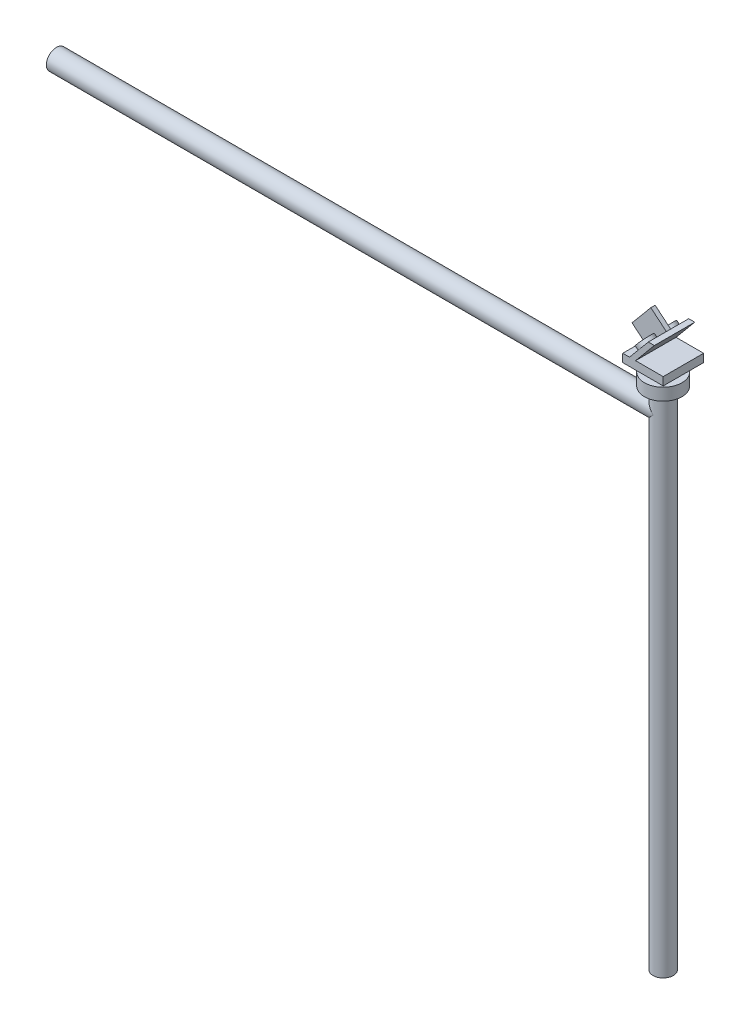
ISO-10303-21;
HEADER;
FILE_DESCRIPTION(('STEP AP214'),'2;1');
FILE_NAME('part.step','',(''),(''),'','','');
FILE_SCHEMA(('AUTOMOTIVE_DESIGN { 1 0 10303 214 1 1 1 1 }'));
ENDSEC;
DATA;
#1=APPLICATION_CONTEXT('core data for automotive mechanical design processes');
#2=APPLICATION_PROTOCOL_DEFINITION('international standard','automotive_design',2000,#1);
#3=PRODUCT_CONTEXT('',#1,'mechanical');
#4=PRODUCT('Part','Part','',(#3));
#5=PRODUCT_RELATED_PRODUCT_CATEGORY('part','',(#4));
#6=PRODUCT_DEFINITION_FORMATION('','',#4);
#7=PRODUCT_DEFINITION_CONTEXT('part definition',#1,'design');
#8=PRODUCT_DEFINITION('design','',#6,#7);
#9=PRODUCT_DEFINITION_SHAPE('','',#8);
#10=(LENGTH_UNIT() NAMED_UNIT(*) SI_UNIT(.MILLI.,.METRE.));
#11=(NAMED_UNIT(*) PLANE_ANGLE_UNIT() SI_UNIT($,.RADIAN.));
#12=(NAMED_UNIT(*) SI_UNIT($,.STERADIAN.) SOLID_ANGLE_UNIT());
#13=UNCERTAINTY_MEASURE_WITH_UNIT(LENGTH_MEASURE(1.E-05),#10,'distance_accuracy_value','');
#14=(GEOMETRIC_REPRESENTATION_CONTEXT(3) GLOBAL_UNCERTAINTY_ASSIGNED_CONTEXT((#13)) GLOBAL_UNIT_ASSIGNED_CONTEXT((#10,
#11,#12)) REPRESENTATION_CONTEXT('',''));
#15=CARTESIAN_POINT('',(0.,0.,0.));
#16=DIRECTION('',(0.,0.,1.));
#17=DIRECTION('',(1.,0.,0.));
#18=AXIS2_PLACEMENT_3D('',#15,#16,#17);
#19=CARTESIAN_POINT('',(-1.77307486485236,135.423873636658,2.7674601771231));
#20=DIRECTION('',(0.767916250220789,-0.640550257705703,0.));
#21=DIRECTION('',(0.640550257705703,0.767916250220789,0.));
#22=AXIS2_PLACEMENT_3D('',#19,#20,#21);
#23=CYLINDRICAL_SURFACE('',#22,2.00000000000001);
#24=CARTESIAN_POINT('',(-1.77307486485236,135.423873636658,2.7674601771231));
#25=DIRECTION('',(-0.767916250220789,0.640550257705703,0.));
#26=DIRECTION('',(-0.640550257705703,-0.767916250220789,0.));
#27=AXIS2_PLACEMENT_3D('',#24,#25,#26);
#28=CIRCLE('',#27,2.00000000000001);
#29=CARTESIAN_POINT('',(-3.05417538026377,133.888041136216,2.7674601771231));
#30=VERTEX_POINT('',#29);
#31=EDGE_CURVE('E11',#30,#30,#28,.T.);
#32=ORIENTED_EDGE('',*,*,#31,.F.);
#33=EDGE_LOOP('',(#32));
#34=FACE_BOUND('',#33,.T.);
#35=CARTESIAN_POINT('',(-1.00515861463157,134.783323378952,2.7674601771231));
#36=DIRECTION('',(-0.767916250220789,0.640550257705703,0.));
#37=DIRECTION('',(-0.640550257705703,-0.767916250220789,0.));
#38=AXIS2_PLACEMENT_3D('',#35,#36,#37);
#39=CIRCLE('',#38,2.00000000000001);
#40=CARTESIAN_POINT('',(-2.28625913004298,133.24749087851,2.7674601771231));
#41=VERTEX_POINT('',#40);
#42=EDGE_CURVE('E53',#41,#41,#39,.T.);
#43=ORIENTED_EDGE('',*,*,#42,.T.);
#44=EDGE_LOOP('',(#43));
#45=FACE_BOUND('',#44,.T.);
#46=ADVANCED_FACE('F50',(#34,#45),#23,.T.);
#47=CARTESIAN_POINT('',(-1.77307486485236,135.423873636658,2.7674601771231));
#48=DIRECTION('',(-0.767916250220789,0.640550257705703,0.));
#49=DIRECTION('',(-0.640550257705703,-0.767916250220789,0.));
#50=AXIS2_PLACEMENT_3D('',#47,#48,#49);
#51=PLANE('',#50);
#52=ORIENTED_EDGE('',*,*,#31,.T.);
#53=EDGE_LOOP('',(#52));
#54=FACE_BOUND('',#53,.T.);
#55=ADVANCED_FACE('F65',(#54),#51,.T.);
#56=CARTESIAN_POINT('',(-1.00515861463157,134.783323378952,2.7674601771231));
#57=DIRECTION('',(-0.767916250220789,0.640550257705703,0.));
#58=DIRECTION('',(-0.640550257705703,-0.767916250220789,0.));
#59=AXIS2_PLACEMENT_3D('',#56,#57,#58);
#60=PLANE('',#59);
#61=ORIENTED_EDGE('',*,*,#42,.F.);
#62=EDGE_LOOP('',(#61));
#63=FACE_BOUND('',#62,.T.);
#64=ADVANCED_FACE('F63',(#63),#60,.F.);
#65=CLOSED_SHELL('',(#46,#55,#64));
#66=MANIFOLD_SOLID_BREP('B2',#65);
#67=CARTESIAN_POINT('',(-1.77307486485236,135.423873636658,-2.76746017712311));
#68=DIRECTION('',(0.767916250220789,-0.640550257705703,0.));
#69=DIRECTION('',(0.640550257705703,0.767916250220789,0.));
#70=AXIS2_PLACEMENT_3D('',#67,#68,#69);
#71=CYLINDRICAL_SURFACE('',#70,2.);
#72=CARTESIAN_POINT('',(-1.77307486485236,135.423873636658,-2.76746017712311));
#73=DIRECTION('',(-0.767916250220789,0.640550257705703,0.));
#74=DIRECTION('',(-0.640550257705703,-0.767916250220789,0.));
#75=AXIS2_PLACEMENT_3D('',#72,#73,#74);
#76=CIRCLE('',#75,2.);
#77=CARTESIAN_POINT('',(-3.05417538026377,133.888041136216,-2.76746017712311));
#78=VERTEX_POINT('',#77);
#79=EDGE_CURVE('E49',#78,#78,#76,.T.);
#80=ORIENTED_EDGE('',*,*,#79,.F.);
#81=EDGE_LOOP('',(#80));
#82=FACE_BOUND('',#81,.T.);
#83=CARTESIAN_POINT('',(-1.00515861463157,134.783323378952,-2.76746017712311));
#84=DIRECTION('',(-0.767916250220789,0.640550257705703,0.));
#85=DIRECTION('',(-0.640550257705703,-0.767916250220789,0.));
#86=AXIS2_PLACEMENT_3D('',#83,#84,#85);
#87=CIRCLE('',#86,2.);
#88=CARTESIAN_POINT('',(-2.28625913004298,133.24749087851,-2.76746017712311));
#89=VERTEX_POINT('',#88);
#90=EDGE_CURVE('E104',#89,#89,#87,.T.);
#91=ORIENTED_EDGE('',*,*,#90,.T.);
#92=EDGE_LOOP('',(#91));
#93=FACE_BOUND('',#92,.T.);
#94=ADVANCED_FACE('F101',(#82,#93),#71,.T.);
#95=CARTESIAN_POINT('',(-1.77307486485236,135.423873636658,-2.76746017712311));
#96=DIRECTION('',(-0.767916250220789,0.640550257705703,0.));
#97=DIRECTION('',(-0.640550257705703,-0.767916250220789,0.));
#98=AXIS2_PLACEMENT_3D('',#95,#96,#97);
#99=PLANE('',#98);
#100=ORIENTED_EDGE('',*,*,#79,.T.);
#101=EDGE_LOOP('',(#100));
#102=FACE_BOUND('',#101,.T.);
#103=ADVANCED_FACE('F116',(#102),#99,.T.);
#104=CARTESIAN_POINT('',(-1.00515861463157,134.783323378952,-2.76746017712311));
#105=DIRECTION('',(-0.767916250220789,0.640550257705703,0.));
#106=DIRECTION('',(-0.640550257705703,-0.767916250220789,0.));
#107=AXIS2_PLACEMENT_3D('',#104,#105,#106);
#108=PLANE('',#107);
#109=ORIENTED_EDGE('',*,*,#90,.F.);
#110=EDGE_LOOP('',(#109));
#111=FACE_BOUND('',#110,.T.);
#112=ADVANCED_FACE('F114',(#111),#108,.F.);
#113=CLOSED_SHELL('',(#94,#103,#112));
#114=MANIFOLD_SOLID_BREP('B6',#113);
#115=CARTESIAN_POINT('',(0.,125.,0.));
#116=DIRECTION('',(0.,1.,0.));
#117=DIRECTION('',(0.,0.,1.));
#118=AXIS2_PLACEMENT_3D('',#115,#116,#117);
#119=CYLINDRICAL_SURFACE('',#118,4.63253292566429);
#120=CARTESIAN_POINT('',(0.,125.,0.));
#121=DIRECTION('',(0.,1.,0.));
#122=DIRECTION('',(0.,0.,1.));
#123=AXIS2_PLACEMENT_3D('',#120,#121,#122);
#124=CIRCLE('',#123,4.63253292566429);
#125=CARTESIAN_POINT('',(0.,125.,4.63253292566429));
#126=VERTEX_POINT('',#125);
#127=EDGE_CURVE('E100',#126,#126,#124,.T.);
#128=ORIENTED_EDGE('',*,*,#127,.T.);
#129=EDGE_LOOP('',(#128));
#130=FACE_BOUND('',#129,.T.);
#131=CARTESIAN_POINT('',(0.,128.,0.));
#132=DIRECTION('',(0.,1.,0.));
#133=DIRECTION('',(0.,0.,1.));
#134=AXIS2_PLACEMENT_3D('',#131,#132,#133);
#135=CIRCLE('',#134,4.63253292566429);
#136=CARTESIAN_POINT('',(0.,128.,4.63253292566429));
#137=VERTEX_POINT('',#136);
#138=EDGE_CURVE('E156',#137,#137,#135,.T.);
#139=ORIENTED_EDGE('',*,*,#138,.F.);
#140=EDGE_LOOP('',(#139));
#141=FACE_BOUND('',#140,.T.);
#142=ADVANCED_FACE('F153',(#130,#141),#119,.T.);
#143=CARTESIAN_POINT('',(0.,125.,0.));
#144=DIRECTION('',(0.,1.,0.));
#145=DIRECTION('',(0.,0.,1.));
#146=AXIS2_PLACEMENT_3D('',#143,#144,#145);
#147=PLANE('',#146);
#148=CARTESIAN_POINT('',(0.,125.,0.));
#149=DIRECTION('',(0.,1.,0.));
#150=DIRECTION('',(0.,0.,1.));
#151=AXIS2_PLACEMENT_3D('',#148,#149,#150);
#152=CIRCLE('',#151,2.5);
#153=CARTESIAN_POINT('',(0.,125.,2.5));
#154=VERTEX_POINT('',#153);
#155=EDGE_CURVE('E163',#154,#154,#152,.T.);
#156=ORIENTED_EDGE('',*,*,#155,.T.);
#157=EDGE_LOOP('',(#156));
#158=FACE_BOUND('',#157,.T.);
#159=ORIENTED_EDGE('',*,*,#127,.F.);
#160=EDGE_LOOP('',(#159));
#161=FACE_BOUND('',#160,.T.);
#162=ADVANCED_FACE('F171',(#158,#161),#147,.F.);
#163=CARTESIAN_POINT('',(0.,128.,0.));
#164=DIRECTION('',(0.,1.,0.));
#165=DIRECTION('',(0.,0.,1.));
#166=AXIS2_PLACEMENT_3D('',#163,#164,#165);
#167=PLANE('',#166);
#168=CARTESIAN_POINT('',(0.,128.,0.));
#169=DIRECTION('',(0.,1.,0.));
#170=DIRECTION('',(0.,0.,1.));
#171=AXIS2_PLACEMENT_3D('',#168,#169,#170);
#172=CIRCLE('',#171,2.5);
#173=CARTESIAN_POINT('',(0.,128.,2.5));
#174=VERTEX_POINT('',#173);
#175=EDGE_CURVE('E165',#174,#174,#172,.T.);
#176=ORIENTED_EDGE('',*,*,#175,.F.);
#177=EDGE_LOOP('',(#176));
#178=FACE_BOUND('',#177,.T.);
#179=ORIENTED_EDGE('',*,*,#138,.T.);
#180=EDGE_LOOP('',(#179));
#181=FACE_BOUND('',#180,.T.);
#182=ADVANCED_FACE('F177',(#178,#181),#167,.T.);
#183=CARTESIAN_POINT('',(0.,125.,0.));
#184=DIRECTION('',(0.,1.,0.));
#185=DIRECTION('',(0.,0.,1.));
#186=AXIS2_PLACEMENT_3D('',#183,#184,#185);
#187=CYLINDRICAL_SURFACE('',#186,2.5);
#188=ORIENTED_EDGE('',*,*,#155,.F.);
#189=EDGE_LOOP('',(#188));
#190=FACE_BOUND('',#189,.T.);
#191=ORIENTED_EDGE('',*,*,#175,.T.);
#192=EDGE_LOOP('',(#191));
#193=FACE_BOUND('',#192,.T.);
#194=ADVANCED_FACE('F174',(#190,#193),#187,.F.);
#195=CLOSED_SHELL('',(#142,#162,#182,#194));
#196=MANIFOLD_SOLID_BREP('B44',#195);
#197=CARTESIAN_POINT('',(-3.32684214086689,132.,-5.));
#198=DIRECTION('',(-0.767916250220789,0.640550257705703,0.));
#199=DIRECTION('',(-0.640550257705703,-0.76791625022079,0.));
#200=AXIS2_PLACEMENT_3D('',#197,#198,#199);
#201=PLANE('',#200);
#202=DIRECTION('',(0.,0.,1.));
#203=VECTOR('',#202,1.);
#204=CARTESIAN_POINT('',(1.31652491160376,137.566646757904,-5.));
#205=LINE('',#204,#203);
#206=CARTESIAN_POINT('',(1.31652491160376,137.566646757904,0.53492035424621));
#207=VERTEX_POINT('',#206);
#208=CARTESIAN_POINT('',(1.31652491160376,137.566646757904,5.));
#209=VERTEX_POINT('',#208);
#210=EDGE_CURVE('E375',#207,#209,#205,.T.);
#211=ORIENTED_EDGE('',*,*,#210,.F.);
#212=DIRECTION('',(0.640550257705703,0.767916250220789,0.));
#213=VECTOR('',#212,1.);
#214=CARTESIAN_POINT('',(1.31652491160375,137.566646757904,0.53492035424621));
#215=LINE('',#214,#213);
#216=CARTESIAN_POINT('',(-3.32684214086688,132.,0.53492035424621));
#217=VERTEX_POINT('',#216);
#218=EDGE_CURVE('E233',#217,#207,#215,.T.);
#219=ORIENTED_EDGE('',*,*,#218,.F.);
#220=DIRECTION('',(0.,0.,1.));
#221=VECTOR('',#220,1.);
#222=CARTESIAN_POINT('',(-3.32684214086689,132.,-5.));
#223=LINE('',#222,#221);
#224=CARTESIAN_POINT('',(-3.32684214086689,132.,5.));
#225=VERTEX_POINT('',#224);
#226=EDGE_CURVE('E370',#217,#225,#223,.T.);
#227=ORIENTED_EDGE('',*,*,#226,.T.);
#228=DIRECTION('',(-0.640550257705703,-0.767916250220789,0.));
#229=VECTOR('',#228,1.);
#230=CARTESIAN_POINT('',(-3.32684214086689,132.,5.));
#231=LINE('',#230,#229);
#232=EDGE_CURVE('E351',#209,#225,#231,.T.);
#233=ORIENTED_EDGE('',*,*,#232,.F.);
#234=EDGE_LOOP('',(#211,#219,#227,#233));
#235=FACE_BOUND('',#234,.T.);
#236=ADVANCED_FACE('F217',(#235),#201,.T.);
#237=CARTESIAN_POINT('',(-3.32684214086689,132.,-5.));
#238=VERTEX_POINT('',#237);
#239=CARTESIAN_POINT('',(-3.32684214086688,132.,-0.534920354246212));
#240=VERTEX_POINT('',#239);
#241=EDGE_CURVE('E365',#238,#240,#223,.T.);
#242=ORIENTED_EDGE('',*,*,#241,.T.);
#243=DIRECTION('',(-0.640550257705703,-0.767916250220789,0.));
#244=VECTOR('',#243,1.);
#245=CARTESIAN_POINT('',(1.31652491160375,137.566646757904,-0.534920354246212));
#246=LINE('',#245,#244);
#247=CARTESIAN_POINT('',(1.31652491160375,137.566646757904,-0.534920354246212));
#248=VERTEX_POINT('',#247);
#249=EDGE_CURVE('E536',#248,#240,#246,.T.);
#250=ORIENTED_EDGE('',*,*,#249,.F.);
#251=CARTESIAN_POINT('',(1.31652491160376,137.566646757904,-5.));
#252=VERTEX_POINT('',#251);
#253=EDGE_CURVE('E371',#252,#248,#205,.T.);
#254=ORIENTED_EDGE('',*,*,#253,.F.);
#255=DIRECTION('',(-0.640550257705703,-0.767916250220789,0.));
#256=VECTOR('',#255,1.);
#257=CARTESIAN_POINT('',(-3.32684214086689,132.,-5.));
#258=LINE('',#257,#256);
#259=EDGE_CURVE('E355',#252,#238,#258,.T.);
#260=ORIENTED_EDGE('',*,*,#259,.T.);
#261=EDGE_LOOP('',(#242,#250,#254,#260));
#262=FACE_BOUND('',#261,.T.);
#263=ADVANCED_FACE('F458',(#262),#201,.T.);
#264=CARTESIAN_POINT('',(0.,132.,0.));
#265=DIRECTION('',(0.,1.,0.));
#266=DIRECTION('',(0.,0.,1.));
#267=AXIS2_PLACEMENT_3D('',#264,#265,#266);
#268=PLANE('',#267);
#269=DIRECTION('',(-1.,0.,0.));
#270=VECTOR('',#269,1.);
#271=CARTESIAN_POINT('',(-5.,132.,-5.));
#272=LINE('',#271,#270);
#273=CARTESIAN_POINT('',(5.,132.,-5.));
#274=VERTEX_POINT('',#273);
#275=CARTESIAN_POINT('',(-1.82684214086689,132.,-5.));
#276=VERTEX_POINT('',#275);
#277=EDGE_CURVE('E387',#274,#276,#272,.T.);
#278=ORIENTED_EDGE('',*,*,#277,.T.);
#279=DIRECTION('',(0.,0.,1.));
#280=VECTOR('',#279,1.);
#281=CARTESIAN_POINT('',(-1.82684214086689,132.,-5.));
#282=LINE('',#281,#280);
#283=CARTESIAN_POINT('',(-1.82684214086689,132.,5.));
#284=VERTEX_POINT('',#283);
#285=EDGE_CURVE('E357',#276,#284,#282,.T.);
#286=ORIENTED_EDGE('',*,*,#285,.T.);
#287=DIRECTION('',(1.,0.,0.));
#288=VECTOR('',#287,1.);
#289=CARTESIAN_POINT('',(-5.,132.,5.));
#290=LINE('',#289,#288);
#291=CARTESIAN_POINT('',(5.,132.,5.));
#292=VERTEX_POINT('',#291);
#293=EDGE_CURVE('E394',#284,#292,#290,.T.);
#294=ORIENTED_EDGE('',*,*,#293,.T.);
#295=DIRECTION('',(0.,0.,-1.));
#296=VECTOR('',#295,1.);
#297=CARTESIAN_POINT('',(5.,132.,-5.));
#298=LINE('',#297,#296);
#299=EDGE_CURVE('E381',#292,#274,#298,.T.);
#300=ORIENTED_EDGE('',*,*,#299,.T.);
#301=EDGE_LOOP('',(#278,#286,#294,#300));
#302=FACE_BOUND('',#301,.T.);
#303=ADVANCED_FACE('F455',(#302),#268,.T.);
#304=CARTESIAN_POINT('',(-150.,120.,0.));
#305=DIRECTION('',(-1.,0.,0.));
#306=DIRECTION('',(0.,0.,1.));
#307=AXIS2_PLACEMENT_3D('',#304,#305,#306);
#308=PLANE('',#307);
#309=CARTESIAN_POINT('',(-150.,120.,0.));
#310=DIRECTION('',(-1.,0.,0.));
#311=DIRECTION('',(0.,0.,1.));
#312=AXIS2_PLACEMENT_3D('',#309,#310,#311);
#313=CIRCLE('',#312,2.5);
#314=CARTESIAN_POINT('',(-150.,120.,2.5));
#315=VERTEX_POINT('',#314);
#316=EDGE_CURVE('E430',#315,#315,#313,.T.);
#317=ORIENTED_EDGE('',*,*,#316,.T.);
#318=EDGE_LOOP('',(#317));
#319=FACE_BOUND('',#318,.T.);
#320=ADVANCED_FACE('F219',(#319),#308,.T.);
#321=CARTESIAN_POINT('',(0.,0.,0.));
#322=DIRECTION('',(0.,1.,0.));
#323=DIRECTION('',(0.,0.,1.));
#324=AXIS2_PLACEMENT_3D('',#321,#322,#323);
#325=PLANE('',#324);
#326=CARTESIAN_POINT('',(0.,0.,0.));
#327=DIRECTION('',(0.,1.,0.));
#328=DIRECTION('',(0.,0.,1.));
#329=AXIS2_PLACEMENT_3D('',#326,#327,#328);
#330=CIRCLE('',#329,2.5);
#331=CARTESIAN_POINT('',(0.,0.,2.5));
#332=VERTEX_POINT('',#331);
#333=EDGE_CURVE('E431',#332,#332,#330,.T.);
#334=ORIENTED_EDGE('',*,*,#333,.F.);
#335=EDGE_LOOP('',(#334));
#336=FACE_BOUND('',#335,.T.);
#337=ADVANCED_FACE('F445',(#336),#325,.F.);
#338=CARTESIAN_POINT('',(5.60000000000001,120.,0.));
#339=DIRECTION('',(-1.,0.,0.));
#340=DIRECTION('',(0.,0.,1.));
#341=AXIS2_PLACEMENT_3D('',#338,#339,#340);
#342=CYLINDRICAL_SURFACE('',#341,2.5);
#343=CARTESIAN_POINT('',(0.,120.,0.));
#344=DIRECTION('',(-0.707106781186547,-0.707106781186547,0.));
#345=DIRECTION('',(-0.707106781186547,0.707106781186547,0.));
#346=AXIS2_PLACEMENT_3D('',#343,#344,#345);
#347=ELLIPSE('',#346,3.53553390593274,2.5);
#348=CARTESIAN_POINT('',(0.,120.,-2.5));
#349=VERTEX_POINT('',#348);
#350=CARTESIAN_POINT('',(0.,120.,2.5));
#351=VERTEX_POINT('',#350);
#352=EDGE_CURVE('E151',#349,#351,#347,.F.);
#353=ORIENTED_EDGE('',*,*,#352,.F.);
#354=CARTESIAN_POINT('',(0.,120.,0.));
#355=DIRECTION('',(-0.707106781186547,0.707106781186547,0.));
#356=DIRECTION('',(0.707106781186548,0.707106781186548,0.));
#357=AXIS2_PLACEMENT_3D('',#354,#355,#356);
#358=ELLIPSE('',#357,3.53553390593274,2.5);
#359=EDGE_CURVE('E226',#351,#349,#358,.F.);
#360=ORIENTED_EDGE('',*,*,#359,.F.);
#361=EDGE_LOOP('',(#353,#360));
#362=FACE_BOUND('',#361,.T.);
#363=ORIENTED_EDGE('',*,*,#316,.F.);
#364=EDGE_LOOP('',(#363));
#365=FACE_BOUND('',#364,.T.);
#366=ADVANCED_FACE('F442',(#362,#365),#342,.T.);
#367=CARTESIAN_POINT('',(0.,0.,0.));
#368=DIRECTION('',(0.,1.,0.));
#369=DIRECTION('',(0.,0.,1.));
#370=AXIS2_PLACEMENT_3D('',#367,#368,#369);
#371=CYLINDRICAL_SURFACE('',#370,2.5);
#372=ORIENTED_EDGE('',*,*,#359,.T.);
#373=ORIENTED_EDGE('',*,*,#352,.T.);
#374=EDGE_LOOP('',(#372,#373));
#375=FACE_BOUND('',#374,.T.);
#376=ORIENTED_EDGE('',*,*,#333,.T.);
#377=EDGE_LOOP('',(#376));
#378=FACE_BOUND('',#377,.T.);
#379=CARTESIAN_POINT('',(0.,130.,0.));
#380=DIRECTION('',(0.,1.,0.));
#381=DIRECTION('',(0.,0.,1.));
#382=AXIS2_PLACEMENT_3D('',#379,#380,#381);
#383=CIRCLE('',#382,2.5);
#384=CARTESIAN_POINT('',(0.,130.,2.5));
#385=VERTEX_POINT('',#384);
#386=EDGE_CURVE('E426',#385,#385,#383,.T.);
#387=ORIENTED_EDGE('',*,*,#386,.F.);
#388=EDGE_LOOP('',(#387));
#389=FACE_BOUND('',#388,.T.);
#390=ADVANCED_FACE('F444',(#375,#378,#389),#371,.T.);
#391=CARTESIAN_POINT('',(5.,132.,-5.));
#392=DIRECTION('',(-1.,0.,0.));
#393=DIRECTION('',(0.,0.,1.));
#394=AXIS2_PLACEMENT_3D('',#391,#392,#393);
#395=PLANE('',#394);
#396=DIRECTION('',(0.,0.,-1.));
#397=VECTOR('',#396,1.);
#398=CARTESIAN_POINT('',(5.,130.,-5.));
#399=LINE('',#398,#397);
#400=CARTESIAN_POINT('',(5.,130.,5.));
#401=VERTEX_POINT('',#400);
#402=CARTESIAN_POINT('',(5.,130.,-5.));
#403=VERTEX_POINT('',#402);
#404=EDGE_CURVE('E369',#401,#403,#399,.T.);
#405=ORIENTED_EDGE('',*,*,#404,.T.);
#406=DIRECTION('',(0.,-1.,0.));
#407=VECTOR('',#406,1.);
#408=CARTESIAN_POINT('',(5.,132.,-5.));
#409=LINE('',#408,#407);
#410=EDGE_CURVE('E422',#274,#403,#409,.T.);
#411=ORIENTED_EDGE('',*,*,#410,.F.);
#412=ORIENTED_EDGE('',*,*,#299,.F.);
#413=DIRECTION('',(0.,-1.,0.));
#414=VECTOR('',#413,1.);
#415=CARTESIAN_POINT('',(5.,132.,5.));
#416=LINE('',#415,#414);
#417=EDGE_CURVE('E399',#292,#401,#416,.T.);
#418=ORIENTED_EDGE('',*,*,#417,.T.);
#419=EDGE_LOOP('',(#405,#411,#412,#418));
#420=FACE_BOUND('',#419,.T.);
#421=ADVANCED_FACE('F452',(#420),#395,.F.);
#422=CARTESIAN_POINT('',(-5.,132.,-5.));
#423=DIRECTION('',(0.,0.,1.));
#424=DIRECTION('',(1.,0.,0.));
#425=AXIS2_PLACEMENT_3D('',#422,#423,#424);
#426=PLANE('',#425);
#427=DIRECTION('',(-1.,0.,0.));
#428=VECTOR('',#427,1.);
#429=CARTESIAN_POINT('',(-5.,130.,-5.));
#430=LINE('',#429,#428);
#431=CARTESIAN_POINT('',(-5.,130.,-5.));
#432=VERTEX_POINT('',#431);
#433=EDGE_CURVE('E403',#403,#432,#430,.T.);
#434=ORIENTED_EDGE('',*,*,#433,.T.);
#435=DIRECTION('',(0.,-1.,0.));
#436=VECTOR('',#435,1.);
#437=CARTESIAN_POINT('',(-5.,132.,-5.));
#438=LINE('',#437,#436);
#439=CARTESIAN_POINT('',(-5.,132.,-5.));
#440=VERTEX_POINT('',#439);
#441=EDGE_CURVE('E418',#440,#432,#438,.T.);
#442=ORIENTED_EDGE('',*,*,#441,.F.);
#443=EDGE_CURVE('E385',#238,#440,#272,.T.);
#444=ORIENTED_EDGE('',*,*,#443,.F.);
#445=ORIENTED_EDGE('',*,*,#259,.F.);
#446=DIRECTION('',(-1.,0.,0.));
#447=VECTOR('',#446,1.);
#448=CARTESIAN_POINT('',(1.31652491160376,137.566646757904,-5.));
#449=LINE('',#448,#447);
#450=CARTESIAN_POINT('',(2.81652491160376,137.566646757904,-5.));
#451=VERTEX_POINT('',#450);
#452=EDGE_CURVE('E350',#451,#252,#449,.T.);
#453=ORIENTED_EDGE('',*,*,#452,.F.);
#454=DIRECTION('',(0.640550257705702,0.767916250220789,0.));
#455=VECTOR('',#454,1.);
#456=CARTESIAN_POINT('',(2.81652491160376,137.566646757904,-5.));
#457=LINE('',#456,#455);
#458=EDGE_CURVE('E346',#276,#451,#457,.T.);
#459=ORIENTED_EDGE('',*,*,#458,.F.);
#460=ORIENTED_EDGE('',*,*,#277,.F.);
#461=ORIENTED_EDGE('',*,*,#410,.T.);
#462=EDGE_LOOP('',(#434,#442,#444,#445,#453,#459,#460,#461));
#463=FACE_BOUND('',#462,.T.);
#464=ADVANCED_FACE('F490',(#463),#426,.F.);
#465=CARTESIAN_POINT('',(-5.,132.,-5.));
#466=DIRECTION('',(1.,0.,0.));
#467=DIRECTION('',(0.,0.,-1.));
#468=AXIS2_PLACEMENT_3D('',#465,#466,#467);
#469=PLANE('',#468);
#470=DIRECTION('',(0.,0.,1.));
#471=VECTOR('',#470,1.);
#472=CARTESIAN_POINT('',(-5.,130.,-5.));
#473=LINE('',#472,#471);
#474=CARTESIAN_POINT('',(-5.,130.,5.));
#475=VERTEX_POINT('',#474);
#476=EDGE_CURVE('E406',#432,#475,#473,.T.);
#477=ORIENTED_EDGE('',*,*,#476,.T.);
#478=DIRECTION('',(0.,-1.,0.));
#479=VECTOR('',#478,1.);
#480=CARTESIAN_POINT('',(-5.,132.,5.));
#481=LINE('',#480,#479);
#482=CARTESIAN_POINT('',(-5.,132.,5.));
#483=VERTEX_POINT('',#482);
#484=EDGE_CURVE('E414',#483,#475,#481,.T.);
#485=ORIENTED_EDGE('',*,*,#484,.F.);
#486=DIRECTION('',(0.,0.,1.));
#487=VECTOR('',#486,1.);
#488=CARTESIAN_POINT('',(-5.,132.,-5.));
#489=LINE('',#488,#487);
#490=EDGE_CURVE('E391',#440,#483,#489,.T.);
#491=ORIENTED_EDGE('',*,*,#490,.F.);
#492=ORIENTED_EDGE('',*,*,#441,.T.);
#493=EDGE_LOOP('',(#477,#485,#491,#492));
#494=FACE_BOUND('',#493,.T.);
#495=ADVANCED_FACE('F486',(#494),#469,.F.);
#496=CARTESIAN_POINT('',(-5.,132.,5.));
#497=DIRECTION('',(0.,0.,-1.));
#498=DIRECTION('',(-1.,0.,0.));
#499=AXIS2_PLACEMENT_3D('',#496,#497,#498);
#500=PLANE('',#499);
#501=DIRECTION('',(1.,0.,0.));
#502=VECTOR('',#501,1.);
#503=CARTESIAN_POINT('',(-5.,130.,5.));
#504=LINE('',#503,#502);
#505=EDGE_CURVE('E386',#475,#401,#504,.T.);
#506=ORIENTED_EDGE('',*,*,#505,.T.);
#507=ORIENTED_EDGE('',*,*,#417,.F.);
#508=ORIENTED_EDGE('',*,*,#293,.F.);
#509=DIRECTION('',(0.640550257705702,0.767916250220789,0.));
#510=VECTOR('',#509,1.);
#511=CARTESIAN_POINT('',(2.81652491160376,137.566646757904,5.));
#512=LINE('',#511,#510);
#513=CARTESIAN_POINT('',(2.81652491160376,137.566646757904,5.));
#514=VERTEX_POINT('',#513);
#515=EDGE_CURVE('E241',#284,#514,#512,.T.);
#516=ORIENTED_EDGE('',*,*,#515,.T.);
#517=DIRECTION('',(-1.,0.,0.));
#518=VECTOR('',#517,1.);
#519=CARTESIAN_POINT('',(1.31652491160376,137.566646757904,5.));
#520=LINE('',#519,#518);
#521=EDGE_CURVE('E340',#514,#209,#520,.T.);
#522=ORIENTED_EDGE('',*,*,#521,.T.);
#523=ORIENTED_EDGE('',*,*,#232,.T.);
#524=EDGE_CURVE('E395',#483,#225,#290,.T.);
#525=ORIENTED_EDGE('',*,*,#524,.F.);
#526=ORIENTED_EDGE('',*,*,#484,.T.);
#527=EDGE_LOOP('',(#506,#507,#508,#516,#522,#523,#525,#526));
#528=FACE_BOUND('',#527,.T.);
#529=ADVANCED_FACE('F479',(#528),#500,.F.);
#530=ORIENTED_EDGE('',*,*,#241,.F.);
#531=ORIENTED_EDGE('',*,*,#443,.T.);
#532=ORIENTED_EDGE('',*,*,#490,.T.);
#533=ORIENTED_EDGE('',*,*,#524,.T.);
#534=ORIENTED_EDGE('',*,*,#226,.F.);
#535=DIRECTION('',(0.,0.,1.));
#536=VECTOR('',#535,1.);
#537=CARTESIAN_POINT('',(-3.32684214086688,132.,-0.534920354246212));
#538=LINE('',#537,#536);
#539=EDGE_CURVE('E333',#240,#217,#538,.T.);
#540=ORIENTED_EDGE('',*,*,#539,.F.);
#541=EDGE_LOOP('',(#530,#531,#532,#533,#534,#540));
#542=FACE_BOUND('',#541,.T.);
#543=ADVANCED_FACE('F476',(#542),#268,.T.);
#544=CARTESIAN_POINT('',(0.,130.,0.));
#545=DIRECTION('',(0.,1.,0.));
#546=DIRECTION('',(0.,0.,1.));
#547=AXIS2_PLACEMENT_3D('',#544,#545,#546);
#548=PLANE('',#547);
#549=ORIENTED_EDGE('',*,*,#386,.T.);
#550=EDGE_LOOP('',(#549));
#551=FACE_BOUND('',#550,.T.);
#552=ORIENTED_EDGE('',*,*,#404,.F.);
#553=ORIENTED_EDGE('',*,*,#505,.F.);
#554=ORIENTED_EDGE('',*,*,#476,.F.);
#555=ORIENTED_EDGE('',*,*,#433,.F.);
#556=EDGE_LOOP('',(#552,#553,#554,#555));
#557=FACE_BOUND('',#556,.T.);
#558=ADVANCED_FACE('F472',(#551,#557),#548,.F.);
#559=CARTESIAN_POINT('',(1.31652491160376,137.566646757904,-5.));
#560=DIRECTION('',(0.,1.,0.));
#561=DIRECTION('',(0.,0.,1.));
#562=AXIS2_PLACEMENT_3D('',#559,#560,#561);
#563=PLANE('',#562);
#564=ORIENTED_EDGE('',*,*,#521,.F.);
#565=DIRECTION('',(0.,0.,1.));
#566=VECTOR('',#565,1.);
#567=CARTESIAN_POINT('',(2.81652491160376,137.566646757904,-5.));
#568=LINE('',#567,#566);
#569=EDGE_CURVE('E376',#451,#514,#568,.T.);
#570=ORIENTED_EDGE('',*,*,#569,.F.);
#571=ORIENTED_EDGE('',*,*,#452,.T.);
#572=ORIENTED_EDGE('',*,*,#253,.T.);
#573=DIRECTION('',(0.,0.,-1.));
#574=VECTOR('',#573,1.);
#575=CARTESIAN_POINT('',(1.31652491160375,137.566646757904,-0.534920354246212));
#576=LINE('',#575,#574);
#577=EDGE_CURVE('E539',#207,#248,#576,.T.);
#578=ORIENTED_EDGE('',*,*,#577,.F.);
#579=ORIENTED_EDGE('',*,*,#210,.T.);
#580=EDGE_LOOP('',(#564,#570,#571,#572,#578,#579));
#581=FACE_BOUND('',#580,.T.);
#582=ADVANCED_FACE('F468',(#581),#563,.T.);
#583=CARTESIAN_POINT('',(2.81652491160376,137.566646757904,-5.));
#584=DIRECTION('',(0.767916250220789,-0.640550257705702,0.));
#585=DIRECTION('',(0.640550257705703,0.76791625022079,0.));
#586=AXIS2_PLACEMENT_3D('',#583,#584,#585);
#587=PLANE('',#586);
#588=ORIENTED_EDGE('',*,*,#515,.F.);
#589=ORIENTED_EDGE('',*,*,#285,.F.);
#590=ORIENTED_EDGE('',*,*,#458,.T.);
#591=ORIENTED_EDGE('',*,*,#569,.T.);
#592=EDGE_LOOP('',(#588,#589,#590,#591));
#593=FACE_BOUND('',#592,.T.);
#594=ADVANCED_FACE('F471',(#593),#587,.T.);
#595=CARTESIAN_POINT('',(-2.5230563395002,140.769398046432,0.53492035424621));
#596=DIRECTION('',(0.,0.,-1.));
#597=DIRECTION('',(-1.,0.,0.));
#598=AXIS2_PLACEMENT_3D('',#595,#596,#597);
#599=PLANE('',#598);
#600=ORIENTED_EDGE('',*,*,#218,.T.);
#601=DIRECTION('',(0.767916250220789,-0.640550257705703,0.));
#602=VECTOR('',#601,1.);
#603=CARTESIAN_POINT('',(-2.5230563395002,140.769398046432,0.53492035424621));
#604=LINE('',#603,#602);
#605=CARTESIAN_POINT('',(-2.5230563395002,140.769398046432,0.53492035424621));
#606=VERTEX_POINT('',#605);
#607=EDGE_CURVE('E317',#606,#207,#604,.T.);
#608=ORIENTED_EDGE('',*,*,#607,.F.);
#609=DIRECTION('',(0.640550257705703,0.767916250220789,0.));
#610=VECTOR('',#609,1.);
#611=CARTESIAN_POINT('',(-2.5230563395002,140.769398046432,0.53492035424621));
#612=LINE('',#611,#610);
#613=CARTESIAN_POINT('',(-7.16642339197083,135.202751288529,0.53492035424621));
#614=VERTEX_POINT('',#613);
#615=EDGE_CURVE('E325',#614,#606,#612,.T.);
#616=ORIENTED_EDGE('',*,*,#615,.F.);
#617=DIRECTION('',(0.767916250220789,-0.640550257705703,0.));
#618=VECTOR('',#617,1.);
#619=CARTESIAN_POINT('',(-7.16642339197083,135.202751288529,0.53492035424621));
#620=LINE('',#619,#618);
#621=EDGE_CURVE('E543',#614,#217,#620,.T.);
#622=ORIENTED_EDGE('',*,*,#621,.T.);
#623=EDGE_LOOP('',(#600,#608,#616,#622));
#624=FACE_BOUND('',#623,.T.);
#625=ADVANCED_FACE('F335',(#624),#599,.F.);
#626=CARTESIAN_POINT('',(-2.5230563395002,140.769398046432,-0.534920354246212));
#627=DIRECTION('',(-0.640550257705703,-0.767916250220789,0.));
#628=DIRECTION('',(0.767916250220789,-0.640550257705703,0.));
#629=AXIS2_PLACEMENT_3D('',#626,#627,#628);
#630=PLANE('',#629);
#631=ORIENTED_EDGE('',*,*,#577,.T.);
#632=DIRECTION('',(0.767916250220789,-0.640550257705703,0.));
#633=VECTOR('',#632,1.);
#634=CARTESIAN_POINT('',(-2.5230563395002,140.769398046432,-0.534920354246212));
#635=LINE('',#634,#633);
#636=CARTESIAN_POINT('',(-2.5230563395002,140.769398046432,-0.534920354246212));
#637=VERTEX_POINT('',#636);
#638=EDGE_CURVE('E320',#637,#248,#635,.T.);
#639=ORIENTED_EDGE('',*,*,#638,.F.);
#640=DIRECTION('',(0.,0.,-1.));
#641=VECTOR('',#640,1.);
#642=CARTESIAN_POINT('',(-2.5230563395002,140.769398046432,-0.534920354246212));
#643=LINE('',#642,#641);
#644=EDGE_CURVE('E314',#606,#637,#643,.T.);
#645=ORIENTED_EDGE('',*,*,#644,.F.);
#646=ORIENTED_EDGE('',*,*,#607,.T.);
#647=EDGE_LOOP('',(#631,#639,#645,#646));
#648=FACE_BOUND('',#647,.T.);
#649=ADVANCED_FACE('F316',(#648),#630,.F.);
#650=CARTESIAN_POINT('',(-2.5230563395002,140.769398046432,-0.534920354246212));
#651=DIRECTION('',(0.,0.,1.));
#652=DIRECTION('',(1.,0.,0.));
#653=AXIS2_PLACEMENT_3D('',#650,#651,#652);
#654=PLANE('',#653);
#655=ORIENTED_EDGE('',*,*,#249,.T.);
#656=DIRECTION('',(0.767916250220789,-0.640550257705703,0.));
#657=VECTOR('',#656,1.);
#658=CARTESIAN_POINT('',(-7.16642339197083,135.202751288529,-0.534920354246212));
#659=LINE('',#658,#657);
#660=CARTESIAN_POINT('',(-7.16642339197083,135.202751288529,-0.534920354246212));
#661=VERTEX_POINT('',#660);
#662=EDGE_CURVE('E342',#661,#240,#659,.T.);
#663=ORIENTED_EDGE('',*,*,#662,.F.);
#664=DIRECTION('',(-0.640550257705703,-0.767916250220789,0.));
#665=VECTOR('',#664,1.);
#666=CARTESIAN_POINT('',(-2.5230563395002,140.769398046432,-0.534920354246212));
#667=LINE('',#666,#665);
#668=EDGE_CURVE('E324',#637,#661,#667,.T.);
#669=ORIENTED_EDGE('',*,*,#668,.F.);
#670=ORIENTED_EDGE('',*,*,#638,.T.);
#671=EDGE_LOOP('',(#655,#663,#669,#670));
#672=FACE_BOUND('',#671,.T.);
#673=ADVANCED_FACE('F549',(#672),#654,.F.);
#674=CARTESIAN_POINT('',(-7.16642339197083,135.202751288529,-0.534920354246212));
#675=DIRECTION('',(0.640550257705703,0.767916250220789,0.));
#676=DIRECTION('',(-0.767916250220789,0.640550257705703,0.));
#677=AXIS2_PLACEMENT_3D('',#674,#675,#676);
#678=PLANE('',#677);
#679=ORIENTED_EDGE('',*,*,#539,.T.);
#680=ORIENTED_EDGE('',*,*,#621,.F.);
#681=DIRECTION('',(0.,0.,1.));
#682=VECTOR('',#681,1.);
#683=CARTESIAN_POINT('',(-7.16642339197083,135.202751288529,-0.534920354246212));
#684=LINE('',#683,#682);
#685=EDGE_CURVE('E330',#661,#614,#684,.T.);
#686=ORIENTED_EDGE('',*,*,#685,.F.);
#687=ORIENTED_EDGE('',*,*,#662,.T.);
#688=EDGE_LOOP('',(#679,#680,#686,#687));
#689=FACE_BOUND('',#688,.T.);
#690=ADVANCED_FACE('F547',(#689),#678,.F.);
#691=CARTESIAN_POINT('',(-70.7307463102312,58.9993996919702,0.));
#692=DIRECTION('',(-0.767916250220789,0.640550257705703,0.));
#693=DIRECTION('',(-0.640550257705703,-0.767916250220789,0.));
#694=AXIS2_PLACEMENT_3D('',#691,#692,#693);
#695=PLANE('',#694);
#696=ORIENTED_EDGE('',*,*,#615,.T.);
#697=ORIENTED_EDGE('',*,*,#644,.T.);
#698=ORIENTED_EDGE('',*,*,#668,.T.);
#699=ORIENTED_EDGE('',*,*,#685,.T.);
#700=EDGE_LOOP('',(#696,#697,#698,#699));
#701=FACE_BOUND('',#700,.T.);
#702=ADVANCED_FACE('F328',(#701),#695,.T.);
#703=CLOSED_SHELL('',(#236,#263,#303,#320,#337,#366,#390,#421,#464,#495,#529,#543,#558,#582,
#594,#625,#649,#673,#690,#702));
#704=MANIFOLD_SOLID_BREP('B95',#703);
#705=ADVANCED_BREP_SHAPE_REPRESENTATION('',(#18,#66,#114,#196,#704),#14);
#706=SHAPE_DEFINITION_REPRESENTATION(#9,#705);
ENDSEC;
END-ISO-10303-21;
